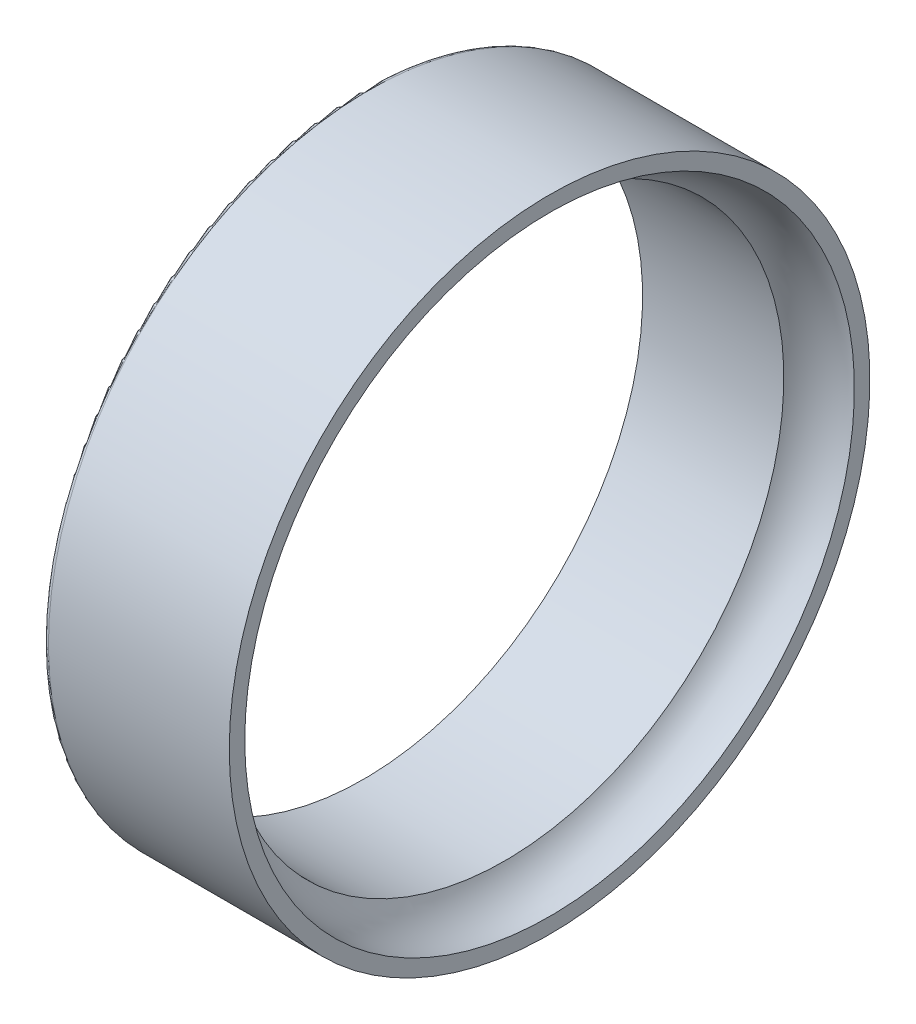
ISO-10303-21;
HEADER;
FILE_DESCRIPTION(('STEP AP214'),'2;1');
FILE_NAME('part.step','',(''),(''),'','','');
FILE_SCHEMA(('AUTOMOTIVE_DESIGN { 1 0 10303 214 1 1 1 1 }'));
ENDSEC;
DATA;
#1=APPLICATION_CONTEXT('core data for automotive mechanical design processes');
#2=APPLICATION_PROTOCOL_DEFINITION('international standard','automotive_design',2000,#1);
#3=PRODUCT_CONTEXT('',#1,'mechanical');
#4=PRODUCT('Part','Part','',(#3));
#5=PRODUCT_RELATED_PRODUCT_CATEGORY('part','',(#4));
#6=PRODUCT_DEFINITION_FORMATION('','',#4);
#7=PRODUCT_DEFINITION_CONTEXT('part definition',#1,'design');
#8=PRODUCT_DEFINITION('design','',#6,#7);
#9=PRODUCT_DEFINITION_SHAPE('','',#8);
#10=(LENGTH_UNIT() NAMED_UNIT(*) SI_UNIT(.MILLI.,.METRE.));
#11=(NAMED_UNIT(*) PLANE_ANGLE_UNIT() SI_UNIT($,.RADIAN.));
#12=(NAMED_UNIT(*) SI_UNIT($,.STERADIAN.) SOLID_ANGLE_UNIT());
#13=UNCERTAINTY_MEASURE_WITH_UNIT(LENGTH_MEASURE(1.E-05),#10,'distance_accuracy_value','');
#14=(GEOMETRIC_REPRESENTATION_CONTEXT(3) GLOBAL_UNCERTAINTY_ASSIGNED_CONTEXT((#13)) GLOBAL_UNIT_ASSIGNED_CONTEXT((#10,
#11,#12)) REPRESENTATION_CONTEXT('',''));
#15=CARTESIAN_POINT('',(0.,0.,0.));
#16=DIRECTION('',(0.,0.,1.));
#17=DIRECTION('',(1.,0.,0.));
#18=AXIS2_PLACEMENT_3D('',#15,#16,#17);
#19=CARTESIAN_POINT('',(0.,27.,0.));
#20=DIRECTION('',(1.,0.,0.));
#21=DIRECTION('',(0.,0.,-1.));
#22=AXIS2_PLACEMENT_3D('',#19,#20,#21);
#23=PLANE('',#22);
#24=CARTESIAN_POINT('',(0.,0.,0.));
#25=DIRECTION('',(-1.,0.,0.));
#26=DIRECTION('',(0.,0.,1.));
#27=AXIS2_PLACEMENT_3D('',#24,#25,#26);
#28=CIRCLE('',#27,27.);
#29=CARTESIAN_POINT('',(0.,0.,27.));
#30=VERTEX_POINT('',#29);
#31=EDGE_CURVE('E53',#30,#30,#28,.T.);
#32=ORIENTED_EDGE('',*,*,#31,.F.);
#33=EDGE_LOOP('',(#32));
#34=FACE_BOUND('',#33,.T.);
#35=CARTESIAN_POINT('',(0.,0.,0.));
#36=DIRECTION('',(-1.,0.,0.));
#37=DIRECTION('',(0.,0.,1.));
#38=AXIS2_PLACEMENT_3D('',#35,#36,#37);
#39=CIRCLE('',#38,30.5);
#40=CARTESIAN_POINT('',(0.,0.,30.5));
#41=VERTEX_POINT('',#40);
#42=EDGE_CURVE('E10',#41,#41,#39,.T.);
#43=ORIENTED_EDGE('',*,*,#42,.T.);
#44=EDGE_LOOP('',(#43));
#45=FACE_BOUND('',#44,.T.);
#46=ADVANCED_FACE('F31',(#34,#45),#23,.F.);
#47=CARTESIAN_POINT('',(0.5,0.,0.));
#48=DIRECTION('',(-1.,0.,0.));
#49=DIRECTION('',(0.,0.,1.));
#50=AXIS2_PLACEMENT_3D('',#47,#48,#49);
#51=TOROIDAL_SURFACE('',#50,30.5,0.5);
#52=ORIENTED_EDGE('',*,*,#42,.F.);
#53=EDGE_LOOP('',(#52));
#54=FACE_BOUND('',#53,.T.);
#55=CARTESIAN_POINT('',(0.500000000000003,0.,0.));
#56=DIRECTION('',(-1.,0.,0.));
#57=DIRECTION('',(0.,0.,1.));
#58=AXIS2_PLACEMENT_3D('',#55,#56,#57);
#59=CIRCLE('',#58,31.);
#60=CARTESIAN_POINT('',(0.500000000000003,0.,31.));
#61=VERTEX_POINT('',#60);
#62=EDGE_CURVE('E37',#61,#61,#59,.T.);
#63=ORIENTED_EDGE('',*,*,#62,.T.);
#64=EDGE_LOOP('',(#63));
#65=FACE_BOUND('',#64,.T.);
#66=ADVANCED_FACE('F60',(#54,#65),#51,.T.);
#67=CARTESIAN_POINT('',(-2.82226393786133,0.,0.));
#68=DIRECTION('',(-1.,0.,0.));
#69=DIRECTION('',(0.,0.,1.));
#70=AXIS2_PLACEMENT_3D('',#67,#68,#69);
#71=CYLINDRICAL_SURFACE('',#70,31.);
#72=ORIENTED_EDGE('',*,*,#62,.F.);
#73=EDGE_LOOP('',(#72));
#74=FACE_BOUND('',#73,.T.);
#75=CARTESIAN_POINT('',(18.,0.,0.));
#76=DIRECTION('',(-1.,0.,0.));
#77=DIRECTION('',(0.,0.,1.));
#78=AXIS2_PLACEMENT_3D('',#75,#76,#77);
#79=CIRCLE('',#78,31.);
#80=CARTESIAN_POINT('',(18.,0.,31.));
#81=VERTEX_POINT('',#80);
#82=EDGE_CURVE('E41',#81,#81,#79,.T.);
#83=ORIENTED_EDGE('',*,*,#82,.T.);
#84=EDGE_LOOP('',(#83));
#85=FACE_BOUND('',#84,.T.);
#86=ADVANCED_FACE('F64',(#74,#85),#71,.T.);
#87=CARTESIAN_POINT('',(18.,29.5,0.));
#88=DIRECTION('',(-1.,0.,0.));
#89=DIRECTION('',(0.,0.,1.));
#90=AXIS2_PLACEMENT_3D('',#87,#88,#89);
#91=PLANE('',#90);
#92=ORIENTED_EDGE('',*,*,#82,.F.);
#93=EDGE_LOOP('',(#92));
#94=FACE_BOUND('',#93,.T.);
#95=CARTESIAN_POINT('',(18.,0.,0.));
#96=DIRECTION('',(-1.,0.,0.));
#97=DIRECTION('',(0.,0.,1.));
#98=AXIS2_PLACEMENT_3D('',#95,#96,#97);
#99=CIRCLE('',#98,29.5);
#100=CARTESIAN_POINT('',(18.,0.,29.5));
#101=VERTEX_POINT('',#100);
#102=EDGE_CURVE('E45',#101,#101,#99,.T.);
#103=ORIENTED_EDGE('',*,*,#102,.T.);
#104=EDGE_LOOP('',(#103));
#105=FACE_BOUND('',#104,.T.);
#106=ADVANCED_FACE('F69',(#94,#105),#91,.F.);
#107=CARTESIAN_POINT('',(18.,0.,0.));
#108=DIRECTION('',(-1.,0.,0.));
#109=DIRECTION('',(0.,0.,1.));
#110=AXIS2_PLACEMENT_3D('',#107,#108,#109);
#111=TOROIDAL_SURFACE('',#110,24.5,5.);
#112=ORIENTED_EDGE('',*,*,#102,.F.);
#113=EDGE_LOOP('',(#112));
#114=FACE_BOUND('',#113,.T.);
#115=CARTESIAN_POINT('',(13.6698729810778,0.,0.));
#116=DIRECTION('',(-1.,0.,0.));
#117=DIRECTION('',(0.,0.,1.));
#118=AXIS2_PLACEMENT_3D('',#115,#116,#117);
#119=CIRCLE('',#118,27.);
#120=CARTESIAN_POINT('',(13.6698729810778,0.,27.));
#121=VERTEX_POINT('',#120);
#122=EDGE_CURVE('E50',#121,#121,#119,.T.);
#123=ORIENTED_EDGE('',*,*,#122,.T.);
#124=EDGE_LOOP('',(#123));
#125=FACE_BOUND('',#124,.T.);
#126=ADVANCED_FACE('F75',(#114,#125),#111,.F.);
#127=CARTESIAN_POINT('',(-2.82226393786133,0.,0.));
#128=DIRECTION('',(-1.,0.,0.));
#129=DIRECTION('',(0.,0.,1.));
#130=AXIS2_PLACEMENT_3D('',#127,#128,#129);
#131=CYLINDRICAL_SURFACE('',#130,27.);
#132=ORIENTED_EDGE('',*,*,#122,.F.);
#133=EDGE_LOOP('',(#132));
#134=FACE_BOUND('',#133,.T.);
#135=ORIENTED_EDGE('',*,*,#31,.T.);
#136=EDGE_LOOP('',(#135));
#137=FACE_BOUND('',#136,.T.);
#138=ADVANCED_FACE('F57',(#134,#137),#131,.F.);
#139=CLOSED_SHELL('',(#46,#66,#86,#106,#126,#138));
#140=MANIFOLD_SOLID_BREP('B2',#139);
#141=ADVANCED_BREP_SHAPE_REPRESENTATION('',(#18,#140),#14);
#142=SHAPE_DEFINITION_REPRESENTATION(#9,#141);
ENDSEC;
END-ISO-10303-21;
